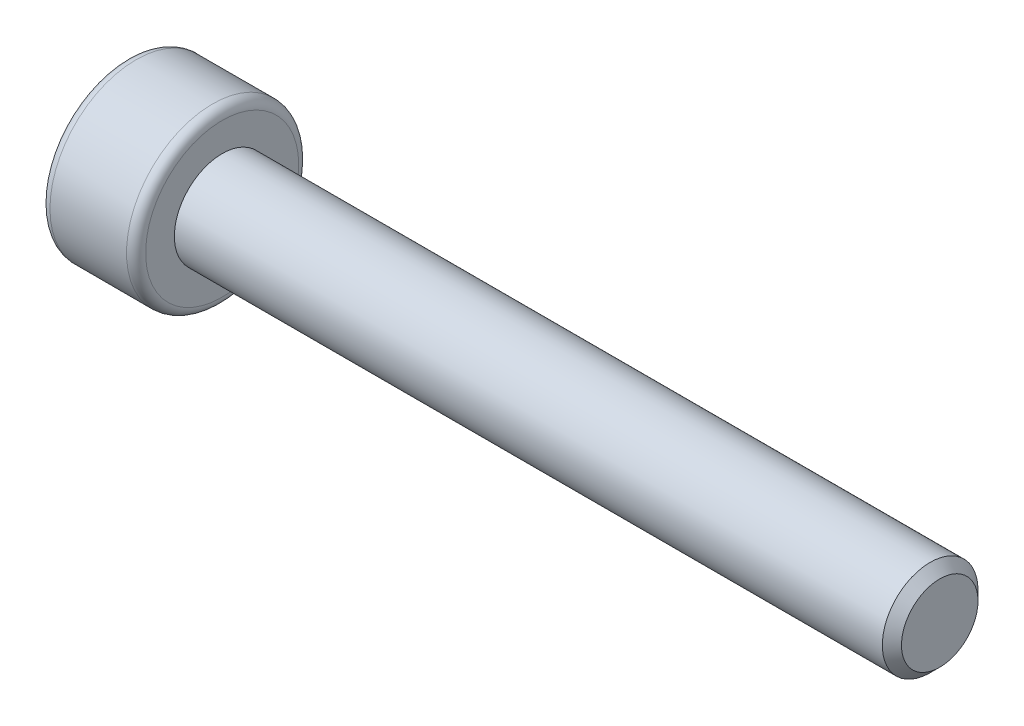
ISO-10303-21;
HEADER;
FILE_DESCRIPTION(('STEP AP214'),'2;1');
FILE_NAME('part.step','',(''),(''),'','','');
FILE_SCHEMA(('AUTOMOTIVE_DESIGN { 1 0 10303 214 1 1 1 1 }'));
ENDSEC;
DATA;
#1=APPLICATION_CONTEXT('core data for automotive mechanical design processes');
#2=APPLICATION_PROTOCOL_DEFINITION('international standard','automotive_design',2000,#1);
#3=PRODUCT_CONTEXT('',#1,'mechanical');
#4=PRODUCT('Part','Part','',(#3));
#5=PRODUCT_RELATED_PRODUCT_CATEGORY('part','',(#4));
#6=PRODUCT_DEFINITION_FORMATION('','',#4);
#7=PRODUCT_DEFINITION_CONTEXT('part definition',#1,'design');
#8=PRODUCT_DEFINITION('design','',#6,#7);
#9=PRODUCT_DEFINITION_SHAPE('','',#8);
#10=(LENGTH_UNIT() NAMED_UNIT(*) SI_UNIT(.MILLI.,.METRE.));
#11=(NAMED_UNIT(*) PLANE_ANGLE_UNIT() SI_UNIT($,.RADIAN.));
#12=(NAMED_UNIT(*) SI_UNIT($,.STERADIAN.) SOLID_ANGLE_UNIT());
#13=UNCERTAINTY_MEASURE_WITH_UNIT(LENGTH_MEASURE(1.E-05),#10,'distance_accuracy_value','');
#14=(GEOMETRIC_REPRESENTATION_CONTEXT(3) GLOBAL_UNCERTAINTY_ASSIGNED_CONTEXT((#13)) GLOBAL_UNIT_ASSIGNED_CONTEXT((#10,
#11,#12)) REPRESENTATION_CONTEXT('',''));
#15=CARTESIAN_POINT('',(0.,0.,0.));
#16=DIRECTION('',(0.,0.,1.));
#17=DIRECTION('',(1.,0.,0.));
#18=AXIS2_PLACEMENT_3D('',#15,#16,#17);
#19=CARTESIAN_POINT('',(-8.5,0.,0.));
#20=DIRECTION('',(-1.,0.,0.));
#21=DIRECTION('',(0.,0.,1.));
#22=AXIS2_PLACEMENT_3D('',#19,#20,#21);
#23=PLANE('',#22);
#24=CARTESIAN_POINT('',(-8.5,0.,0.));
#25=DIRECTION('',(-1.,0.,0.));
#26=DIRECTION('',(0.,0.,1.));
#27=AXIS2_PLACEMENT_3D('',#24,#25,#26);
#28=CIRCLE('',#27,1.6);
#29=CARTESIAN_POINT('',(-8.5,0.,1.6));
#30=VERTEX_POINT('',#29);
#31=EDGE_CURVE('E155',#30,#30,#28,.T.);
#32=ORIENTED_EDGE('',*,*,#31,.T.);
#33=EDGE_LOOP('',(#32));
#34=FACE_BOUND('',#33,.T.);
#35=DIRECTION('',(0.,0.866025403784439,0.5));
#36=VECTOR('',#35,1.);
#37=CARTESIAN_POINT('',(-8.5,-0.75,0.43301270189222));
#38=LINE('',#37,#36);
#39=CARTESIAN_POINT('',(-8.5,-0.75,0.43301270189222));
#40=VERTEX_POINT('',#39);
#41=CARTESIAN_POINT('',(-8.5,0.,0.866025403784439));
#42=VERTEX_POINT('',#41);
#43=EDGE_CURVE('E51',#40,#42,#38,.T.);
#44=ORIENTED_EDGE('',*,*,#43,.F.);
#45=DIRECTION('',(0.,0.,1.));
#46=VECTOR('',#45,1.);
#47=CARTESIAN_POINT('',(-8.5,-0.75,-0.433012701892219));
#48=LINE('',#47,#46);
#49=CARTESIAN_POINT('',(-8.5,-0.75,-0.433012701892219));
#50=VERTEX_POINT('',#49);
#51=EDGE_CURVE('E134',#50,#40,#48,.T.);
#52=ORIENTED_EDGE('',*,*,#51,.F.);
#53=DIRECTION('',(0.,-0.866025403784438,0.5));
#54=VECTOR('',#53,1.);
#55=CARTESIAN_POINT('',(-8.5,0.,-0.866025403784439));
#56=LINE('',#55,#54);
#57=CARTESIAN_POINT('',(-8.5,0.,-0.866025403784439));
#58=VERTEX_POINT('',#57);
#59=EDGE_CURVE('E132',#58,#50,#56,.T.);
#60=ORIENTED_EDGE('',*,*,#59,.F.);
#61=DIRECTION('',(0.,-0.866025403784438,-0.5));
#62=VECTOR('',#61,1.);
#63=CARTESIAN_POINT('',(-8.5,0.75,-0.433012701892219));
#64=LINE('',#63,#62);
#65=CARTESIAN_POINT('',(-8.5,0.75,-0.433012701892219));
#66=VERTEX_POINT('',#65);
#67=EDGE_CURVE('E99',#66,#58,#64,.T.);
#68=ORIENTED_EDGE('',*,*,#67,.F.);
#69=DIRECTION('',(0.,0.,-1.));
#70=VECTOR('',#69,1.);
#71=CARTESIAN_POINT('',(-8.5,0.75,0.433012701892219));
#72=LINE('',#71,#70);
#73=CARTESIAN_POINT('',(-8.5,0.75,0.433012701892219));
#74=VERTEX_POINT('',#73);
#75=EDGE_CURVE('E128',#74,#66,#72,.T.);
#76=ORIENTED_EDGE('',*,*,#75,.F.);
#77=DIRECTION('',(0.,0.866025403784438,-0.5));
#78=VECTOR('',#77,1.);
#79=CARTESIAN_POINT('',(-8.5,0.,0.866025403784439));
#80=LINE('',#79,#78);
#81=EDGE_CURVE('E125',#42,#74,#80,.T.);
#82=ORIENTED_EDGE('',*,*,#81,.F.);
#83=EDGE_LOOP('',(#44,#52,#60,#68,#76,#82));
#84=FACE_BOUND('',#83,.T.);
#85=ADVANCED_FACE('F35',(#34,#84),#23,.T.);
#86=CARTESIAN_POINT('',(8.5,0.,0.));
#87=DIRECTION('',(1.,0.,0.));
#88=DIRECTION('',(0.,0.,-1.));
#89=AXIS2_PLACEMENT_3D('',#86,#87,#88);
#90=CYLINDRICAL_SURFACE('',#89,1.8);
#91=CARTESIAN_POINT('',(-6.7,0.,0.));
#92=DIRECTION('',(1.,0.,0.));
#93=DIRECTION('',(0.,0.,-1.));
#94=AXIS2_PLACEMENT_3D('',#91,#92,#93);
#95=CIRCLE('',#94,1.8);
#96=CARTESIAN_POINT('',(-6.7,0.,-1.8));
#97=VERTEX_POINT('',#96);
#98=EDGE_CURVE('E152',#97,#97,#95,.F.);
#99=ORIENTED_EDGE('',*,*,#98,.T.);
#100=EDGE_LOOP('',(#99));
#101=FACE_BOUND('',#100,.T.);
#102=CARTESIAN_POINT('',(-8.3,0.,0.));
#103=DIRECTION('',(-1.,0.,0.));
#104=DIRECTION('',(0.,0.,1.));
#105=AXIS2_PLACEMENT_3D('',#102,#103,#104);
#106=CIRCLE('',#105,1.8);
#107=CARTESIAN_POINT('',(-8.3,0.,1.8));
#108=VERTEX_POINT('',#107);
#109=EDGE_CURVE('E149',#108,#108,#106,.F.);
#110=ORIENTED_EDGE('',*,*,#109,.T.);
#111=EDGE_LOOP('',(#110));
#112=FACE_BOUND('',#111,.T.);
#113=ADVANCED_FACE('F172',(#101,#112),#90,.T.);
#114=CARTESIAN_POINT('',(-6.5,1.8,0.));
#115=DIRECTION('',(1.,0.,0.));
#116=DIRECTION('',(0.,0.,-1.));
#117=AXIS2_PLACEMENT_3D('',#114,#115,#116);
#118=PLANE('',#117);
#119=CARTESIAN_POINT('',(-6.5,0.,0.));
#120=DIRECTION('',(1.,0.,0.));
#121=DIRECTION('',(0.,0.,-1.));
#122=AXIS2_PLACEMENT_3D('',#119,#120,#121);
#123=CIRCLE('',#122,1.6);
#124=CARTESIAN_POINT('',(-6.5,0.,-1.6));
#125=VERTEX_POINT('',#124);
#126=EDGE_CURVE('E146',#125,#125,#123,.T.);
#127=ORIENTED_EDGE('',*,*,#126,.T.);
#128=EDGE_LOOP('',(#127));
#129=FACE_BOUND('',#128,.T.);
#130=CARTESIAN_POINT('',(-6.5,0.,0.));
#131=DIRECTION('',(1.,0.,0.));
#132=DIRECTION('',(0.,0.,-1.));
#133=AXIS2_PLACEMENT_3D('',#130,#131,#132);
#134=CIRCLE('',#133,1.);
#135=CARTESIAN_POINT('',(-6.5,0.,-1.));
#136=VERTEX_POINT('',#135);
#137=EDGE_CURVE('E138',#136,#136,#134,.T.);
#138=ORIENTED_EDGE('',*,*,#137,.F.);
#139=EDGE_LOOP('',(#138));
#140=FACE_BOUND('',#139,.T.);
#141=ADVANCED_FACE('F178',(#129,#140),#118,.T.);
#142=CARTESIAN_POINT('',(8.5,0.,0.));
#143=DIRECTION('',(1.,0.,0.));
#144=DIRECTION('',(0.,0.,-1.));
#145=AXIS2_PLACEMENT_3D('',#142,#143,#144);
#146=CYLINDRICAL_SURFACE('',#145,1.);
#147=CARTESIAN_POINT('',(8.3,0.,0.));
#148=DIRECTION('',(1.,0.,0.));
#149=DIRECTION('',(0.,0.,-1.));
#150=AXIS2_PLACEMENT_3D('',#147,#148,#149);
#151=CIRCLE('',#150,1.);
#152=CARTESIAN_POINT('',(8.3,0.,-1.));
#153=VERTEX_POINT('',#152);
#154=EDGE_CURVE('E11',#153,#153,#151,.F.);
#155=ORIENTED_EDGE('',*,*,#154,.T.);
#156=EDGE_LOOP('',(#155));
#157=FACE_BOUND('',#156,.T.);
#158=ORIENTED_EDGE('',*,*,#137,.T.);
#159=EDGE_LOOP('',(#158));
#160=FACE_BOUND('',#159,.T.);
#161=ADVANCED_FACE('F197',(#157,#160),#146,.T.);
#162=CARTESIAN_POINT('',(8.5,1.,0.));
#163=DIRECTION('',(1.,0.,0.));
#164=DIRECTION('',(0.,0.,-1.));
#165=AXIS2_PLACEMENT_3D('',#162,#163,#164);
#166=PLANE('',#165);
#167=CARTESIAN_POINT('',(8.5,0.,0.));
#168=DIRECTION('',(1.,0.,0.));
#169=DIRECTION('',(0.,0.,-1.));
#170=AXIS2_PLACEMENT_3D('',#167,#168,#169);
#171=CIRCLE('',#170,0.800000000000002);
#172=CARTESIAN_POINT('',(8.5,0.,-0.800000000000002));
#173=VERTEX_POINT('',#172);
#174=EDGE_CURVE('E44',#173,#173,#171,.T.);
#175=ORIENTED_EDGE('',*,*,#174,.T.);
#176=EDGE_LOOP('',(#175));
#177=FACE_BOUND('',#176,.T.);
#178=ADVANCED_FACE('F160',(#177),#166,.T.);
#179=CARTESIAN_POINT('',(-7.,-0.75,0.43301270189222));
#180=DIRECTION('',(0.,-0.5,0.866025403784439));
#181=DIRECTION('',(0.,-0.866025403784439,-0.5));
#182=AXIS2_PLACEMENT_3D('',#179,#180,#181);
#183=PLANE('',#182);
#184=ORIENTED_EDGE('',*,*,#43,.T.);
#185=DIRECTION('',(-1.,0.,0.));
#186=VECTOR('',#185,1.);
#187=CARTESIAN_POINT('',(-7.,0.,0.866025403784439));
#188=LINE('',#187,#186);
#189=CARTESIAN_POINT('',(-7.,0.,0.866025403784439));
#190=VERTEX_POINT('',#189);
#191=EDGE_CURVE('E81',#190,#42,#188,.T.);
#192=ORIENTED_EDGE('',*,*,#191,.F.);
#193=DIRECTION('',(0.,0.866025403784439,0.5));
#194=VECTOR('',#193,1.);
#195=CARTESIAN_POINT('',(-7.,-0.75,0.43301270189222));
#196=LINE('',#195,#194);
#197=CARTESIAN_POINT('',(-7.,-0.75,0.43301270189222));
#198=VERTEX_POINT('',#197);
#199=EDGE_CURVE('E136',#198,#190,#196,.T.);
#200=ORIENTED_EDGE('',*,*,#199,.F.);
#201=DIRECTION('',(-1.,0.,0.));
#202=VECTOR('',#201,1.);
#203=CARTESIAN_POINT('',(-7.,-0.75,0.43301270189222));
#204=LINE('',#203,#202);
#205=EDGE_CURVE('E59',#198,#40,#204,.T.);
#206=ORIENTED_EDGE('',*,*,#205,.T.);
#207=EDGE_LOOP('',(#184,#192,#200,#206));
#208=FACE_BOUND('',#207,.T.);
#209=ADVANCED_FACE('F206',(#208),#183,.F.);
#210=CARTESIAN_POINT('',(-7.,-0.75,-0.433012701892219));
#211=DIRECTION('',(0.,-1.,0.));
#212=DIRECTION('',(0.,0.,-1.));
#213=AXIS2_PLACEMENT_3D('',#210,#211,#212);
#214=PLANE('',#213);
#215=ORIENTED_EDGE('',*,*,#51,.T.);
#216=ORIENTED_EDGE('',*,*,#205,.F.);
#217=DIRECTION('',(0.,0.,1.));
#218=VECTOR('',#217,1.);
#219=CARTESIAN_POINT('',(-7.,-0.75,-0.433012701892219));
#220=LINE('',#219,#218);
#221=CARTESIAN_POINT('',(-7.,-0.75,-0.433012701892219));
#222=VERTEX_POINT('',#221);
#223=EDGE_CURVE('E111',#222,#198,#220,.T.);
#224=ORIENTED_EDGE('',*,*,#223,.F.);
#225=DIRECTION('',(-1.,0.,0.));
#226=VECTOR('',#225,1.);
#227=CARTESIAN_POINT('',(-7.,-0.75,-0.433012701892219));
#228=LINE('',#227,#226);
#229=EDGE_CURVE('E103',#222,#50,#228,.T.);
#230=ORIENTED_EDGE('',*,*,#229,.T.);
#231=EDGE_LOOP('',(#215,#216,#224,#230));
#232=FACE_BOUND('',#231,.T.);
#233=ADVANCED_FACE('F211',(#232),#214,.F.);
#234=CARTESIAN_POINT('',(-7.,0.,-0.866025403784439));
#235=DIRECTION('',(0.,-0.5,-0.866025403784438));
#236=DIRECTION('',(0.,0.866025403784439,-0.5));
#237=AXIS2_PLACEMENT_3D('',#234,#235,#236);
#238=PLANE('',#237);
#239=ORIENTED_EDGE('',*,*,#59,.T.);
#240=ORIENTED_EDGE('',*,*,#229,.F.);
#241=DIRECTION('',(0.,-0.866025403784438,0.5));
#242=VECTOR('',#241,1.);
#243=CARTESIAN_POINT('',(-7.,0.,-0.866025403784439));
#244=LINE('',#243,#242);
#245=CARTESIAN_POINT('',(-7.,0.,-0.866025403784439));
#246=VERTEX_POINT('',#245);
#247=EDGE_CURVE('E107',#246,#222,#244,.T.);
#248=ORIENTED_EDGE('',*,*,#247,.F.);
#249=DIRECTION('',(-1.,0.,0.));
#250=VECTOR('',#249,1.);
#251=CARTESIAN_POINT('',(-7.,0.,-0.866025403784439));
#252=LINE('',#251,#250);
#253=EDGE_CURVE('E92',#246,#58,#252,.T.);
#254=ORIENTED_EDGE('',*,*,#253,.T.);
#255=EDGE_LOOP('',(#239,#240,#248,#254));
#256=FACE_BOUND('',#255,.T.);
#257=ADVANCED_FACE('F108',(#256),#238,.F.);
#258=CARTESIAN_POINT('',(-7.,0.75,-0.433012701892219));
#259=DIRECTION('',(0.,0.5,-0.866025403784439));
#260=DIRECTION('',(0.,0.866025403784439,0.5));
#261=AXIS2_PLACEMENT_3D('',#258,#259,#260);
#262=PLANE('',#261);
#263=ORIENTED_EDGE('',*,*,#67,.T.);
#264=ORIENTED_EDGE('',*,*,#253,.F.);
#265=DIRECTION('',(0.,-0.866025403784438,-0.5));
#266=VECTOR('',#265,1.);
#267=CARTESIAN_POINT('',(-7.,0.75,-0.433012701892219));
#268=LINE('',#267,#266);
#269=CARTESIAN_POINT('',(-7.,0.75,-0.433012701892219));
#270=VERTEX_POINT('',#269);
#271=EDGE_CURVE('E96',#270,#246,#268,.T.);
#272=ORIENTED_EDGE('',*,*,#271,.F.);
#273=DIRECTION('',(-1.,0.,0.));
#274=VECTOR('',#273,1.);
#275=CARTESIAN_POINT('',(-7.,0.75,-0.433012701892219));
#276=LINE('',#275,#274);
#277=EDGE_CURVE('E104',#270,#66,#276,.T.);
#278=ORIENTED_EDGE('',*,*,#277,.T.);
#279=EDGE_LOOP('',(#263,#264,#272,#278));
#280=FACE_BOUND('',#279,.T.);
#281=ADVANCED_FACE('F94',(#280),#262,.F.);
#282=CARTESIAN_POINT('',(-7.,0.75,0.433012701892219));
#283=DIRECTION('',(0.,1.,0.));
#284=DIRECTION('',(0.,0.,1.));
#285=AXIS2_PLACEMENT_3D('',#282,#283,#284);
#286=PLANE('',#285);
#287=ORIENTED_EDGE('',*,*,#75,.T.);
#288=ORIENTED_EDGE('',*,*,#277,.F.);
#289=DIRECTION('',(0.,0.,-1.));
#290=VECTOR('',#289,1.);
#291=CARTESIAN_POINT('',(-7.,0.75,0.433012701892219));
#292=LINE('',#291,#290);
#293=CARTESIAN_POINT('',(-7.,0.75,0.433012701892219));
#294=VERTEX_POINT('',#293);
#295=EDGE_CURVE('E117',#294,#270,#292,.T.);
#296=ORIENTED_EDGE('',*,*,#295,.F.);
#297=DIRECTION('',(-1.,0.,0.));
#298=VECTOR('',#297,1.);
#299=CARTESIAN_POINT('',(-7.,0.75,0.433012701892219));
#300=LINE('',#299,#298);
#301=EDGE_CURVE('E141',#294,#74,#300,.T.);
#302=ORIENTED_EDGE('',*,*,#301,.T.);
#303=EDGE_LOOP('',(#287,#288,#296,#302));
#304=FACE_BOUND('',#303,.T.);
#305=ADVANCED_FACE('F214',(#304),#286,.F.);
#306=CARTESIAN_POINT('',(-7.,0.,0.866025403784439));
#307=DIRECTION('',(0.,0.5,0.866025403784439));
#308=DIRECTION('',(0.,-0.866025403784439,0.5));
#309=AXIS2_PLACEMENT_3D('',#306,#307,#308);
#310=PLANE('',#309);
#311=ORIENTED_EDGE('',*,*,#81,.T.);
#312=ORIENTED_EDGE('',*,*,#301,.F.);
#313=DIRECTION('',(0.,0.866025403784438,-0.5));
#314=VECTOR('',#313,1.);
#315=CARTESIAN_POINT('',(-7.,0.,0.866025403784439));
#316=LINE('',#315,#314);
#317=EDGE_CURVE('E119',#190,#294,#316,.T.);
#318=ORIENTED_EDGE('',*,*,#317,.F.);
#319=ORIENTED_EDGE('',*,*,#191,.T.);
#320=EDGE_LOOP('',(#311,#312,#318,#319));
#321=FACE_BOUND('',#320,.T.);
#322=ADVANCED_FACE('F189',(#321),#310,.F.);
#323=CARTESIAN_POINT('',(-7.,0.,0.));
#324=DIRECTION('',(-1.,0.,0.));
#325=DIRECTION('',(0.,0.,1.));
#326=AXIS2_PLACEMENT_3D('',#323,#324,#325);
#327=PLANE('',#326);
#328=ORIENTED_EDGE('',*,*,#199,.T.);
#329=ORIENTED_EDGE('',*,*,#317,.T.);
#330=ORIENTED_EDGE('',*,*,#295,.T.);
#331=ORIENTED_EDGE('',*,*,#271,.T.);
#332=ORIENTED_EDGE('',*,*,#247,.T.);
#333=ORIENTED_EDGE('',*,*,#223,.T.);
#334=EDGE_LOOP('',(#328,#329,#330,#331,#332,#333));
#335=FACE_BOUND('',#334,.T.);
#336=ADVANCED_FACE('F114',(#335),#327,.T.);
#337=CARTESIAN_POINT('',(-6.7,0.,0.));
#338=DIRECTION('',(1.,0.,0.));
#339=DIRECTION('',(0.,0.,-1.));
#340=AXIS2_PLACEMENT_3D('',#337,#338,#339);
#341=TOROIDAL_SURFACE('',#340,1.6,0.2);
#342=ORIENTED_EDGE('',*,*,#98,.F.);
#343=EDGE_LOOP('',(#342));
#344=FACE_BOUND('',#343,.T.);
#345=ORIENTED_EDGE('',*,*,#126,.F.);
#346=EDGE_LOOP('',(#345));
#347=FACE_BOUND('',#346,.T.);
#348=ADVANCED_FACE('F168',(#344,#347),#341,.T.);
#349=CARTESIAN_POINT('',(-8.3,0.,0.));
#350=DIRECTION('',(-1.,0.,0.));
#351=DIRECTION('',(0.,0.,1.));
#352=AXIS2_PLACEMENT_3D('',#349,#350,#351);
#353=TOROIDAL_SURFACE('',#352,1.6,0.2);
#354=ORIENTED_EDGE('',*,*,#31,.F.);
#355=EDGE_LOOP('',(#354));
#356=FACE_BOUND('',#355,.T.);
#357=ORIENTED_EDGE('',*,*,#109,.F.);
#358=EDGE_LOOP('',(#357));
#359=FACE_BOUND('',#358,.T.);
#360=ADVANCED_FACE('F163',(#356,#359),#353,.T.);
#361=CARTESIAN_POINT('',(8.5,0.,0.));
#362=DIRECTION('',(-1.,0.,0.));
#363=DIRECTION('',(0.,0.,1.));
#364=AXIS2_PLACEMENT_3D('',#361,#362,#363);
#365=CONICAL_SURFACE('',#364,0.800000000000002,0.785398163397449);
#366=ORIENTED_EDGE('',*,*,#154,.F.);
#367=EDGE_LOOP('',(#366));
#368=FACE_BOUND('',#367,.T.);
#369=ORIENTED_EDGE('',*,*,#174,.F.);
#370=EDGE_LOOP('',(#369));
#371=FACE_BOUND('',#370,.T.);
#372=ADVANCED_FACE('F38',(#368,#371),#365,.T.);
#373=CLOSED_SHELL('',(#85,#113,#141,#161,#178,#209,#233,#257,#281,#305,#322,#336,#348,#360,#372));
#374=MANIFOLD_SOLID_BREP('B2',#373);
#375=ADVANCED_BREP_SHAPE_REPRESENTATION('',(#18,#374),#14);
#376=SHAPE_DEFINITION_REPRESENTATION(#9,#375);
ENDSEC;
END-ISO-10303-21;
